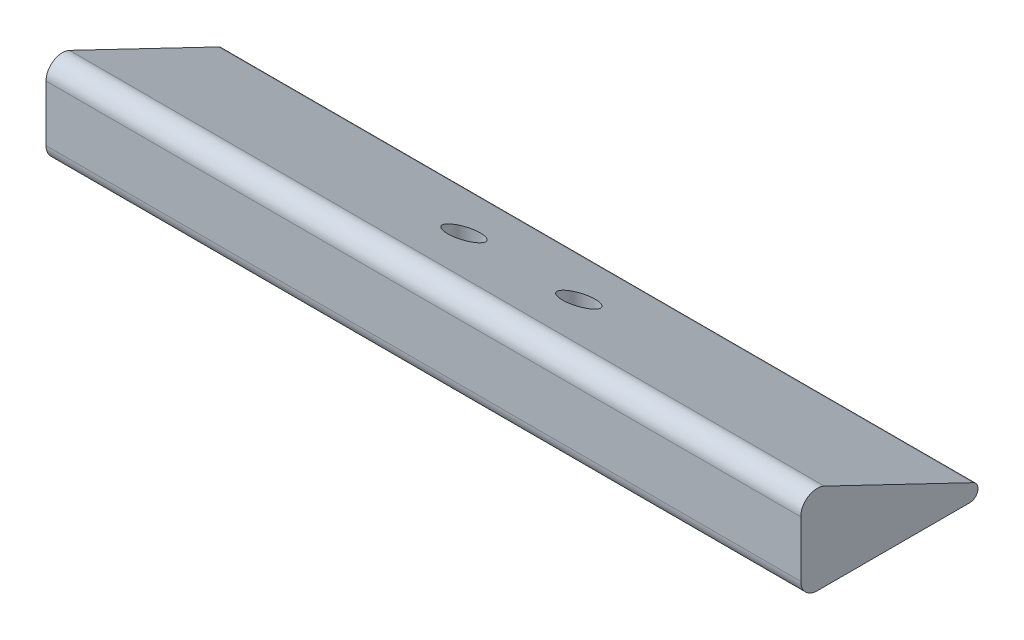
ISO-10303-21;
HEADER;
FILE_DESCRIPTION(('STEP AP214'),'2;1');
FILE_NAME('part.step','',(''),(''),'','','');
FILE_SCHEMA(('AUTOMOTIVE_DESIGN { 1 0 10303 214 1 1 1 1 }'));
ENDSEC;
DATA;
#1=APPLICATION_CONTEXT('core data for automotive mechanical design processes');
#2=APPLICATION_PROTOCOL_DEFINITION('international standard','automotive_design',2000,#1);
#3=PRODUCT_CONTEXT('',#1,'mechanical');
#4=PRODUCT('Part','Part','',(#3));
#5=PRODUCT_RELATED_PRODUCT_CATEGORY('part','',(#4));
#6=PRODUCT_DEFINITION_FORMATION('','',#4);
#7=PRODUCT_DEFINITION_CONTEXT('part definition',#1,'design');
#8=PRODUCT_DEFINITION('design','',#6,#7);
#9=PRODUCT_DEFINITION_SHAPE('','',#8);
#10=(LENGTH_UNIT() NAMED_UNIT(*) SI_UNIT(.MILLI.,.METRE.));
#11=(NAMED_UNIT(*) PLANE_ANGLE_UNIT() SI_UNIT($,.RADIAN.));
#12=(NAMED_UNIT(*) SI_UNIT($,.STERADIAN.) SOLID_ANGLE_UNIT());
#13=UNCERTAINTY_MEASURE_WITH_UNIT(LENGTH_MEASURE(1.E-05),#10,'distance_accuracy_value','');
#14=(GEOMETRIC_REPRESENTATION_CONTEXT(3) GLOBAL_UNCERTAINTY_ASSIGNED_CONTEXT((#13)) GLOBAL_UNIT_ASSIGNED_CONTEXT((#10,
#11,#12)) REPRESENTATION_CONTEXT('',''));
#15=CARTESIAN_POINT('',(0.,0.,0.));
#16=DIRECTION('',(0.,0.,1.));
#17=DIRECTION('',(1.,0.,0.));
#18=AXIS2_PLACEMENT_3D('',#15,#16,#17);
#19=CARTESIAN_POINT('',(92.,8.82153206018207,-2.));
#20=DIRECTION('',(-1.,0.,0.));
#21=DIRECTION('',(0.,0.,1.));
#22=AXIS2_PLACEMENT_3D('',#19,#20,#21);
#23=CYLINDRICAL_SURFACE('',#22,2.);
#24=CARTESIAN_POINT('',(0.,8.82153206018207,-2.));
#25=DIRECTION('',(1.,0.,0.));
#26=DIRECTION('',(0.,0.,1.));
#27=AXIS2_PLACEMENT_3D('',#24,#25,#26);
#28=CIRCLE('',#27,2.);
#29=CARTESIAN_POINT('',(0.,10.6245781751186,-2.86546213516954));
#30=VERTEX_POINT('',#29);
#31=CARTESIAN_POINT('',(0.,8.82153206018207,0.));
#32=VERTEX_POINT('',#31);
#33=EDGE_CURVE('E125',#30,#32,#28,.T.);
#34=ORIENTED_EDGE('',*,*,#33,.T.);
#35=DIRECTION('',(-1.,0.,0.));
#36=VECTOR('',#35,1.);
#37=CARTESIAN_POINT('',(92.,8.82153206018207,0.));
#38=LINE('',#37,#36);
#39=CARTESIAN_POINT('',(92.,8.82153206018207,0.));
#40=VERTEX_POINT('',#39);
#41=EDGE_CURVE('E11',#40,#32,#38,.T.);
#42=ORIENTED_EDGE('',*,*,#41,.F.);
#43=CARTESIAN_POINT('',(92.,8.82153206018207,-2.));
#44=DIRECTION('',(1.,0.,0.));
#45=DIRECTION('',(0.,0.,1.));
#46=AXIS2_PLACEMENT_3D('',#43,#44,#45);
#47=CIRCLE('',#46,2.);
#48=CARTESIAN_POINT('',(92.,10.6245781751186,-2.86546213516954));
#49=VERTEX_POINT('',#48);
#50=EDGE_CURVE('E135',#49,#40,#47,.T.);
#51=ORIENTED_EDGE('',*,*,#50,.F.);
#52=DIRECTION('',(-1.,0.,0.));
#53=VECTOR('',#52,1.);
#54=CARTESIAN_POINT('',(92.,10.6245781751186,-2.86546213516954));
#55=LINE('',#54,#53);
#56=EDGE_CURVE('E121',#49,#30,#55,.T.);
#57=ORIENTED_EDGE('',*,*,#56,.T.);
#58=EDGE_LOOP('',(#34,#42,#51,#57));
#59=FACE_BOUND('',#58,.T.);
#60=ADVANCED_FACE('F39',(#59),#23,.T.);
#61=CARTESIAN_POINT('',(92.,8.82153206018207,0.));
#62=DIRECTION('',(0.,0.,-1.));
#63=DIRECTION('',(-1.,0.,0.));
#64=AXIS2_PLACEMENT_3D('',#61,#62,#63);
#65=PLANE('',#64);
#66=DIRECTION('',(0.,-1.,0.));
#67=VECTOR('',#66,1.);
#68=CARTESIAN_POINT('',(0.,8.82153206018207,0.));
#69=LINE('',#68,#67);
#70=CARTESIAN_POINT('',(0.,2.00000000000001,0.));
#71=VERTEX_POINT('',#70);
#72=EDGE_CURVE('E128',#32,#71,#69,.T.);
#73=ORIENTED_EDGE('',*,*,#72,.T.);
#74=DIRECTION('',(-1.,0.,0.));
#75=VECTOR('',#74,1.);
#76=CARTESIAN_POINT('',(92.,2.00000000000001,0.));
#77=LINE('',#76,#75);
#78=CARTESIAN_POINT('',(92.,2.00000000000001,0.));
#79=VERTEX_POINT('',#78);
#80=EDGE_CURVE('E48',#79,#71,#77,.T.);
#81=ORIENTED_EDGE('',*,*,#80,.F.);
#82=DIRECTION('',(0.,-1.,0.));
#83=VECTOR('',#82,1.);
#84=CARTESIAN_POINT('',(92.,8.82153206018207,0.));
#85=LINE('',#84,#83);
#86=EDGE_CURVE('E94',#40,#79,#85,.T.);
#87=ORIENTED_EDGE('',*,*,#86,.F.);
#88=ORIENTED_EDGE('',*,*,#41,.T.);
#89=EDGE_LOOP('',(#73,#81,#87,#88));
#90=FACE_BOUND('',#89,.T.);
#91=ADVANCED_FACE('F161',(#90),#65,.F.);
#92=CARTESIAN_POINT('',(92.,2.,-2.));
#93=DIRECTION('',(-1.,0.,0.));
#94=DIRECTION('',(0.,0.,1.));
#95=AXIS2_PLACEMENT_3D('',#92,#93,#94);
#96=CYLINDRICAL_SURFACE('',#95,2.);
#97=CARTESIAN_POINT('',(0.,2.,-2.));
#98=DIRECTION('',(1.,0.,0.));
#99=DIRECTION('',(0.,0.,1.));
#100=AXIS2_PLACEMENT_3D('',#97,#98,#99);
#101=CIRCLE('',#100,2.);
#102=CARTESIAN_POINT('',(0.,0.,-2.00000000000001));
#103=VERTEX_POINT('',#102);
#104=EDGE_CURVE('E130',#71,#103,#101,.T.);
#105=ORIENTED_EDGE('',*,*,#104,.T.);
#106=DIRECTION('',(-1.,0.,0.));
#107=VECTOR('',#106,1.);
#108=CARTESIAN_POINT('',(92.,0.,-2.00000000000001));
#109=LINE('',#108,#107);
#110=CARTESIAN_POINT('',(92.,0.,-2.00000000000001));
#111=VERTEX_POINT('',#110);
#112=EDGE_CURVE('E116',#111,#103,#109,.T.);
#113=ORIENTED_EDGE('',*,*,#112,.F.);
#114=CARTESIAN_POINT('',(92.,2.,-2.));
#115=DIRECTION('',(1.,0.,0.));
#116=DIRECTION('',(0.,0.,1.));
#117=AXIS2_PLACEMENT_3D('',#114,#115,#116);
#118=CIRCLE('',#117,2.);
#119=EDGE_CURVE('E107',#79,#111,#118,.T.);
#120=ORIENTED_EDGE('',*,*,#119,.F.);
#121=ORIENTED_EDGE('',*,*,#80,.T.);
#122=EDGE_LOOP('',(#105,#113,#120,#121));
#123=FACE_BOUND('',#122,.T.);
#124=ADVANCED_FACE('F164',(#123),#96,.T.);
#125=CARTESIAN_POINT('',(92.,0.,-2.00000000000001));
#126=DIRECTION('',(0.,1.,0.));
#127=DIRECTION('',(0.,0.,1.));
#128=AXIS2_PLACEMENT_3D('',#125,#126,#127);
#129=PLANE('',#128);
#130=CARTESIAN_POINT('',(39.,0.,-11.951977882722));
#131=DIRECTION('',(0.,1.,0.));
#132=DIRECTION('',(0.,0.,1.));
#133=AXIS2_PLACEMENT_3D('',#130,#131,#132);
#134=CIRCLE('',#133,1.5);
#135=CARTESIAN_POINT('',(39.,0.,-10.451977882722));
#136=VERTEX_POINT('',#135);
#137=EDGE_CURVE('E152',#136,#136,#134,.T.);
#138=ORIENTED_EDGE('',*,*,#137,.T.);
#139=EDGE_LOOP('',(#138));
#140=FACE_BOUND('',#139,.T.);
#141=CARTESIAN_POINT('',(53.,0.,-11.951977882722));
#142=DIRECTION('',(0.,1.,0.));
#143=DIRECTION('',(0.,0.,1.));
#144=AXIS2_PLACEMENT_3D('',#141,#142,#143);
#145=CIRCLE('',#144,1.5);
#146=CARTESIAN_POINT('',(53.,0.,-10.451977882722));
#147=VERTEX_POINT('',#146);
#148=EDGE_CURVE('E155',#147,#147,#145,.T.);
#149=ORIENTED_EDGE('',*,*,#148,.T.);
#150=EDGE_LOOP('',(#149));
#151=FACE_BOUND('',#150,.T.);
#152=DIRECTION('',(0.,0.,-1.));
#153=VECTOR('',#152,1.);
#154=CARTESIAN_POINT('',(0.,0.,-2.00000000000001));
#155=LINE('',#154,#153);
#156=CARTESIAN_POINT('',(0.,0.,-20.6057625626897));
#157=VERTEX_POINT('',#156);
#158=EDGE_CURVE('E115',#103,#157,#155,.T.);
#159=ORIENTED_EDGE('',*,*,#158,.T.);
#160=DIRECTION('',(-1.,0.,0.));
#161=VECTOR('',#160,1.);
#162=CARTESIAN_POINT('',(92.,0.,-20.6057625626897));
#163=LINE('',#162,#161);
#164=CARTESIAN_POINT('',(92.,0.,-20.6057625626897));
#165=VERTEX_POINT('',#164);
#166=EDGE_CURVE('E112',#165,#157,#163,.T.);
#167=ORIENTED_EDGE('',*,*,#166,.F.);
#168=DIRECTION('',(0.,0.,-1.));
#169=VECTOR('',#168,1.);
#170=CARTESIAN_POINT('',(92.,0.,-2.00000000000001));
#171=LINE('',#170,#169);
#172=EDGE_CURVE('E101',#111,#165,#171,.T.);
#173=ORIENTED_EDGE('',*,*,#172,.F.);
#174=ORIENTED_EDGE('',*,*,#112,.T.);
#175=EDGE_LOOP('',(#159,#167,#173,#174));
#176=FACE_BOUND('',#175,.T.);
#177=ADVANCED_FACE('F113',(#140,#151,#176),#129,.F.);
#178=CARTESIAN_POINT('',(92.,1.,-20.6057625626897));
#179=DIRECTION('',(-1.,0.,0.));
#180=DIRECTION('',(0.,0.,1.));
#181=AXIS2_PLACEMENT_3D('',#178,#179,#180);
#182=CYLINDRICAL_SURFACE('',#181,0.999999999999999);
#183=CARTESIAN_POINT('',(0.,1.,-20.6057625626897));
#184=DIRECTION('',(1.,0.,0.));
#185=DIRECTION('',(0.,0.,1.));
#186=AXIS2_PLACEMENT_3D('',#183,#184,#185);
#187=CIRCLE('',#186,0.999999999999999);
#188=CARTESIAN_POINT('',(0.,1.90152305746827,-21.0384936302744));
#189=VERTEX_POINT('',#188);
#190=EDGE_CURVE('E80',#157,#189,#187,.T.);
#191=ORIENTED_EDGE('',*,*,#190,.T.);
#192=DIRECTION('',(-1.,0.,0.));
#193=VECTOR('',#192,1.);
#194=CARTESIAN_POINT('',(92.,1.90152305746827,-21.0384936302744));
#195=LINE('',#194,#193);
#196=CARTESIAN_POINT('',(92.,1.90152305746827,-21.0384936302744));
#197=VERTEX_POINT('',#196);
#198=EDGE_CURVE('E117',#197,#189,#195,.T.);
#199=ORIENTED_EDGE('',*,*,#198,.F.);
#200=CARTESIAN_POINT('',(92.,1.,-20.6057625626897));
#201=DIRECTION('',(1.,0.,0.));
#202=DIRECTION('',(0.,0.,1.));
#203=AXIS2_PLACEMENT_3D('',#200,#201,#202);
#204=CIRCLE('',#203,0.999999999999999);
#205=EDGE_CURVE('E105',#165,#197,#204,.T.);
#206=ORIENTED_EDGE('',*,*,#205,.F.);
#207=ORIENTED_EDGE('',*,*,#166,.T.);
#208=EDGE_LOOP('',(#191,#199,#206,#207));
#209=FACE_BOUND('',#208,.T.);
#210=ADVANCED_FACE('F119',(#209),#182,.T.);
#211=CARTESIAN_POINT('',(92.,1.90152305746827,-21.0384936302744));
#212=DIRECTION('',(0.,-0.901523057468273,0.432731067584771));
#213=DIRECTION('',(0.,-0.432731067584772,-0.901523057468274));
#214=AXIS2_PLACEMENT_3D('',#211,#212,#213);
#215=PLANE('',#214);
#216=CARTESIAN_POINT('',(39.,6.26305061629345,-11.951977882722));
#217=DIRECTION('',(0.,-0.901523057468273,0.432731067584771));
#218=DIRECTION('',(0.,0.432731067584772,0.901523057468274));
#219=AXIS2_PLACEMENT_3D('',#216,#217,#218);
#220=ELLIPSE('',#219,2.21846793981793,2.);
#221=CARTESIAN_POINT('',(39.,7.22305061629345,-9.95197788272198));
#222=VERTEX_POINT('',#221);
#223=EDGE_CURVE('E42',#222,#222,#220,.T.);
#224=ORIENTED_EDGE('',*,*,#223,.T.);
#225=EDGE_LOOP('',(#224));
#226=FACE_BOUND('',#225,.T.);
#227=CARTESIAN_POINT('',(53.,6.26305061629345,-11.951977882722));
#228=DIRECTION('',(0.,-0.901523057468273,0.432731067584771));
#229=DIRECTION('',(0.,0.432731067584772,0.901523057468274));
#230=AXIS2_PLACEMENT_3D('',#227,#228,#229);
#231=ELLIPSE('',#230,2.21846793981793,2.);
#232=CARTESIAN_POINT('',(53.,7.22305061629345,-9.95197788272198));
#233=VERTEX_POINT('',#232);
#234=EDGE_CURVE('E140',#233,#233,#231,.T.);
#235=ORIENTED_EDGE('',*,*,#234,.T.);
#236=EDGE_LOOP('',(#235));
#237=FACE_BOUND('',#236,.T.);
#238=DIRECTION('',(0.,0.432731067584771,0.901523057468273));
#239=VECTOR('',#238,1.);
#240=CARTESIAN_POINT('',(0.,1.90152305746827,-21.0384936302744));
#241=LINE('',#240,#239);
#242=EDGE_CURVE('E86',#189,#30,#241,.T.);
#243=ORIENTED_EDGE('',*,*,#242,.T.);
#244=ORIENTED_EDGE('',*,*,#56,.F.);
#245=DIRECTION('',(0.,0.432731067584771,0.901523057468273));
#246=VECTOR('',#245,1.);
#247=CARTESIAN_POINT('',(92.,1.90152305746827,-21.0384936302744));
#248=LINE('',#247,#246);
#249=EDGE_CURVE('E57',#197,#49,#248,.T.);
#250=ORIENTED_EDGE('',*,*,#249,.F.);
#251=ORIENTED_EDGE('',*,*,#198,.T.);
#252=EDGE_LOOP('',(#243,#244,#250,#251));
#253=FACE_BOUND('',#252,.T.);
#254=ADVANCED_FACE('F169',(#226,#237,#253),#215,.F.);
#255=CARTESIAN_POINT('',(92.,8.82153206018207,-2.));
#256=DIRECTION('',(-1.,0.,0.));
#257=DIRECTION('',(0.,0.,1.));
#258=AXIS2_PLACEMENT_3D('',#255,#256,#257);
#259=PLANE('',#258);
#260=ORIENTED_EDGE('',*,*,#50,.T.);
#261=ORIENTED_EDGE('',*,*,#86,.T.);
#262=ORIENTED_EDGE('',*,*,#119,.T.);
#263=ORIENTED_EDGE('',*,*,#172,.T.);
#264=ORIENTED_EDGE('',*,*,#205,.T.);
#265=ORIENTED_EDGE('',*,*,#249,.T.);
#266=EDGE_LOOP('',(#260,#261,#262,#263,#264,#265));
#267=FACE_BOUND('',#266,.T.);
#268=ADVANCED_FACE('F103',(#267),#259,.F.);
#269=CARTESIAN_POINT('',(0.,8.82153206018207,-2.));
#270=DIRECTION('',(-1.,0.,0.));
#271=DIRECTION('',(0.,0.,1.));
#272=AXIS2_PLACEMENT_3D('',#269,#270,#271);
#273=PLANE('',#272);
#274=ORIENTED_EDGE('',*,*,#33,.F.);
#275=ORIENTED_EDGE('',*,*,#242,.F.);
#276=ORIENTED_EDGE('',*,*,#190,.F.);
#277=ORIENTED_EDGE('',*,*,#158,.F.);
#278=ORIENTED_EDGE('',*,*,#104,.F.);
#279=ORIENTED_EDGE('',*,*,#72,.F.);
#280=EDGE_LOOP('',(#274,#275,#276,#277,#278,#279));
#281=FACE_BOUND('',#280,.T.);
#282=ADVANCED_FACE('F167',(#281),#273,.T.);
#283=CARTESIAN_POINT('',(53.,2.,-11.951977882722));
#284=DIRECTION('',(0.,1.,0.));
#285=DIRECTION('',(0.,0.,1.));
#286=AXIS2_PLACEMENT_3D('',#283,#284,#285);
#287=CYLINDRICAL_SURFACE('',#286,2.);
#288=CARTESIAN_POINT('',(53.,2.,-11.951977882722));
#289=DIRECTION('',(0.,1.,0.));
#290=DIRECTION('',(0.,0.,-1.));
#291=AXIS2_PLACEMENT_3D('',#288,#289,#290);
#292=CIRCLE('',#291,2.);
#293=CARTESIAN_POINT('',(53.,2.,-13.951977882722));
#294=VERTEX_POINT('',#293);
#295=EDGE_CURVE('E147',#294,#294,#292,.T.);
#296=ORIENTED_EDGE('',*,*,#295,.F.);
#297=EDGE_LOOP('',(#296));
#298=FACE_BOUND('',#297,.T.);
#299=ORIENTED_EDGE('',*,*,#234,.F.);
#300=EDGE_LOOP('',(#299));
#301=FACE_BOUND('',#300,.T.);
#302=ADVANCED_FACE('F229',(#298,#301),#287,.F.);
#303=CARTESIAN_POINT('',(53.,2.,-11.951977882722));
#304=DIRECTION('',(0.,-1.,0.));
#305=DIRECTION('',(0.,0.,-1.));
#306=AXIS2_PLACEMENT_3D('',#303,#304,#305);
#307=PLANE('',#306);
#308=CARTESIAN_POINT('',(53.,2.,-11.951977882722));
#309=DIRECTION('',(0.,1.,0.));
#310=DIRECTION('',(0.,0.,1.));
#311=AXIS2_PLACEMENT_3D('',#308,#309,#310);
#312=CIRCLE('',#311,1.5);
#313=CARTESIAN_POINT('',(53.,2.,-10.451977882722));
#314=VERTEX_POINT('',#313);
#315=EDGE_CURVE('E203',#314,#314,#312,.T.);
#316=ORIENTED_EDGE('',*,*,#315,.F.);
#317=EDGE_LOOP('',(#316));
#318=FACE_BOUND('',#317,.T.);
#319=ORIENTED_EDGE('',*,*,#295,.T.);
#320=EDGE_LOOP('',(#319));
#321=FACE_BOUND('',#320,.T.);
#322=ADVANCED_FACE('F224',(#318,#321),#307,.F.);
#323=CARTESIAN_POINT('',(39.,2.,-11.951977882722));
#324=DIRECTION('',(0.,1.,0.));
#325=DIRECTION('',(0.,0.,1.));
#326=AXIS2_PLACEMENT_3D('',#323,#324,#325);
#327=CYLINDRICAL_SURFACE('',#326,2.);
#328=CARTESIAN_POINT('',(39.,2.,-11.951977882722));
#329=DIRECTION('',(0.,1.,0.));
#330=DIRECTION('',(0.,0.,1.));
#331=AXIS2_PLACEMENT_3D('',#328,#329,#330);
#332=CIRCLE('',#331,2.);
#333=CARTESIAN_POINT('',(39.,2.,-9.95197788272198));
#334=VERTEX_POINT('',#333);
#335=EDGE_CURVE('E142',#334,#334,#332,.T.);
#336=ORIENTED_EDGE('',*,*,#335,.F.);
#337=EDGE_LOOP('',(#336));
#338=FACE_BOUND('',#337,.T.);
#339=ORIENTED_EDGE('',*,*,#223,.F.);
#340=EDGE_LOOP('',(#339));
#341=FACE_BOUND('',#340,.T.);
#342=ADVANCED_FACE('F218',(#338,#341),#327,.F.);
#343=CARTESIAN_POINT('',(39.,2.,-11.951977882722));
#344=DIRECTION('',(0.,1.,0.));
#345=DIRECTION('',(0.,0.,1.));
#346=AXIS2_PLACEMENT_3D('',#343,#344,#345);
#347=PLANE('',#346);
#348=CARTESIAN_POINT('',(39.,2.,-11.951977882722));
#349=DIRECTION('',(0.,1.,0.));
#350=DIRECTION('',(0.,0.,1.));
#351=AXIS2_PLACEMENT_3D('',#348,#349,#350);
#352=CIRCLE('',#351,1.5);
#353=CARTESIAN_POINT('',(39.,2.,-10.451977882722));
#354=VERTEX_POINT('',#353);
#355=EDGE_CURVE('E205',#354,#354,#352,.T.);
#356=ORIENTED_EDGE('',*,*,#355,.F.);
#357=EDGE_LOOP('',(#356));
#358=FACE_BOUND('',#357,.T.);
#359=ORIENTED_EDGE('',*,*,#335,.T.);
#360=EDGE_LOOP('',(#359));
#361=FACE_BOUND('',#360,.T.);
#362=ADVANCED_FACE('F215',(#358,#361),#347,.T.);
#363=CARTESIAN_POINT('',(53.,0.,-11.951977882722));
#364=DIRECTION('',(0.,1.,0.));
#365=DIRECTION('',(0.,0.,1.));
#366=AXIS2_PLACEMENT_3D('',#363,#364,#365);
#367=CYLINDRICAL_SURFACE('',#366,1.5);
#368=ORIENTED_EDGE('',*,*,#148,.F.);
#369=EDGE_LOOP('',(#368));
#370=FACE_BOUND('',#369,.T.);
#371=ORIENTED_EDGE('',*,*,#315,.T.);
#372=EDGE_LOOP('',(#371));
#373=FACE_BOUND('',#372,.T.);
#374=ADVANCED_FACE('F217',(#370,#373),#367,.F.);
#375=CARTESIAN_POINT('',(39.,0.,-11.951977882722));
#376=DIRECTION('',(0.,1.,0.));
#377=DIRECTION('',(0.,0.,1.));
#378=AXIS2_PLACEMENT_3D('',#375,#376,#377);
#379=CYLINDRICAL_SURFACE('',#378,1.5);
#380=ORIENTED_EDGE('',*,*,#137,.F.);
#381=EDGE_LOOP('',(#380));
#382=FACE_BOUND('',#381,.T.);
#383=ORIENTED_EDGE('',*,*,#355,.T.);
#384=EDGE_LOOP('',(#383));
#385=FACE_BOUND('',#384,.T.);
#386=ADVANCED_FACE('F213',(#382,#385),#379,.F.);
#387=CLOSED_SHELL('',(#60,#91,#124,#177,#210,#254,#268,#282,#302,#322,#342,#362,#374,#386));
#388=MANIFOLD_SOLID_BREP('B2',#387);
#389=ADVANCED_BREP_SHAPE_REPRESENTATION('',(#18,#388),#14);
#390=SHAPE_DEFINITION_REPRESENTATION(#9,#389);
ENDSEC;
END-ISO-10303-21;
